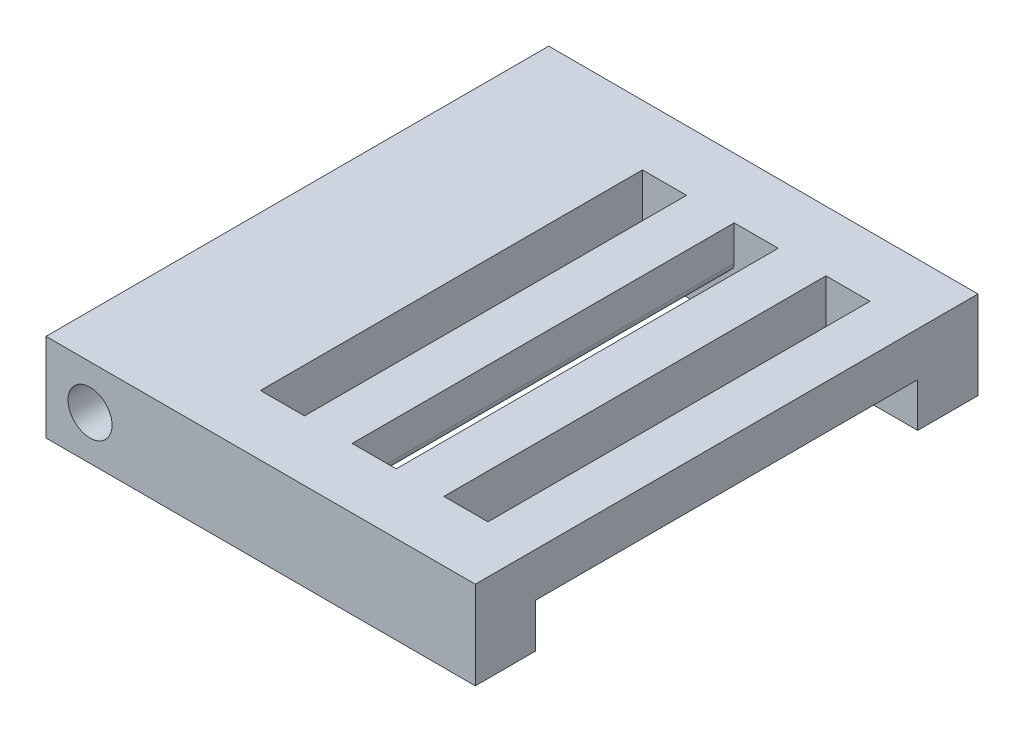
ISO-10303-21;
HEADER;
FILE_DESCRIPTION(('STEP AP214'),'2;1');
FILE_NAME('part.step','',(''),(''),'','','');
FILE_SCHEMA(('AUTOMOTIVE_DESIGN { 1 0 10303 214 1 1 1 1 }'));
ENDSEC;
DATA;
#1=APPLICATION_CONTEXT('core data for automotive mechanical design processes');
#2=APPLICATION_PROTOCOL_DEFINITION('international standard','automotive_design',2000,#1);
#3=PRODUCT_CONTEXT('',#1,'mechanical');
#4=PRODUCT('Part','Part','',(#3));
#5=PRODUCT_RELATED_PRODUCT_CATEGORY('part','',(#4));
#6=PRODUCT_DEFINITION_FORMATION('','',#4);
#7=PRODUCT_DEFINITION_CONTEXT('part definition',#1,'design');
#8=PRODUCT_DEFINITION('design','',#6,#7);
#9=PRODUCT_DEFINITION_SHAPE('','',#8);
#10=(LENGTH_UNIT() NAMED_UNIT(*) SI_UNIT(.MILLI.,.METRE.));
#11=(NAMED_UNIT(*) PLANE_ANGLE_UNIT() SI_UNIT($,.RADIAN.));
#12=(NAMED_UNIT(*) SI_UNIT($,.STERADIAN.) SOLID_ANGLE_UNIT());
#13=UNCERTAINTY_MEASURE_WITH_UNIT(LENGTH_MEASURE(1.E-05),#10,'distance_accuracy_value','');
#14=(GEOMETRIC_REPRESENTATION_CONTEXT(3) GLOBAL_UNCERTAINTY_ASSIGNED_CONTEXT((#13)) GLOBAL_UNIT_ASSIGNED_CONTEXT((#10,
#11,#12)) REPRESENTATION_CONTEXT('',''));
#15=CARTESIAN_POINT('',(0.,0.,0.));
#16=DIRECTION('',(0.,0.,1.));
#17=DIRECTION('',(1.,0.,0.));
#18=AXIS2_PLACEMENT_3D('',#15,#16,#17);
#19=CARTESIAN_POINT('',(0.,0.,0.));
#20=DIRECTION('',(0.,1.,0.));
#21=DIRECTION('',(0.,0.,1.));
#22=AXIS2_PLACEMENT_3D('',#19,#20,#21);
#23=PLANE('',#22);
#24=DIRECTION('',(0.,0.,-1.));
#25=VECTOR('',#24,1.);
#26=CARTESIAN_POINT('',(-33.75,0.,0.));
#27=LINE('',#26,#25);
#28=CARTESIAN_POINT('',(-33.75,0.,82.5));
#29=VERTEX_POINT('',#28);
#30=CARTESIAN_POINT('',(-33.75,0.,75.648107224862));
#31=VERTEX_POINT('',#30);
#32=EDGE_CURVE('E466',#29,#31,#27,.T.);
#33=ORIENTED_EDGE('',*,*,#32,.F.);
#34=DIRECTION('',(-1.,0.,0.));
#35=VECTOR('',#34,1.);
#36=CARTESIAN_POINT('',(0.,0.,82.5));
#37=LINE('',#36,#35);
#38=CARTESIAN_POINT('',(-82.5,0.,82.5));
#39=VERTEX_POINT('',#38);
#40=EDGE_CURVE('E344',#29,#39,#37,.T.);
#41=ORIENTED_EDGE('',*,*,#40,.T.);
#42=DIRECTION('',(0.,0.,1.));
#43=VECTOR('',#42,1.);
#44=CARTESIAN_POINT('',(-82.5,0.,0.));
#45=LINE('',#44,#43);
#46=CARTESIAN_POINT('',(-82.5,0.,25.4162676476213));
#47=VERTEX_POINT('',#46);
#48=EDGE_CURVE('E334',#47,#39,#45,.T.);
#49=ORIENTED_EDGE('',*,*,#48,.F.);
#50=DIRECTION('',(1.,0.,0.));
#51=VECTOR('',#50,1.);
#52=CARTESIAN_POINT('',(0.,0.,25.4162676476213));
#53=LINE('',#52,#51);
#54=CARTESIAN_POINT('',(-33.75,0.,25.4162676476213));
#55=VERTEX_POINT('',#54);
#56=EDGE_CURVE('E469',#47,#55,#53,.T.);
#57=ORIENTED_EDGE('',*,*,#56,.T.);
#58=DIRECTION('',(0.,0.,1.));
#59=VECTOR('',#58,1.);
#60=CARTESIAN_POINT('',(-33.75,0.,25.4162676476213));
#61=LINE('',#60,#59);
#62=CARTESIAN_POINT('',(-33.75,0.,32.2662676476213));
#63=VERTEX_POINT('',#62);
#64=EDGE_CURVE('E324',#55,#63,#61,.T.);
#65=ORIENTED_EDGE('',*,*,#64,.T.);
#66=DIRECTION('',(-1.,0.,0.));
#67=VECTOR('',#66,1.);
#68=CARTESIAN_POINT('',(-33.75,0.,32.2662676476213));
#69=LINE('',#68,#67);
#70=CARTESIAN_POINT('',(-65.,0.,32.2662676476213));
#71=VERTEX_POINT('',#70);
#72=EDGE_CURVE('E306',#63,#71,#69,.T.);
#73=ORIENTED_EDGE('',*,*,#72,.T.);
#74=DIRECTION('',(0.,0.,1.));
#75=VECTOR('',#74,1.);
#76=CARTESIAN_POINT('',(-65.,0.,0.));
#77=LINE('',#76,#75);
#78=CARTESIAN_POINT('',(-65.,0.,75.6481072248632));
#79=VERTEX_POINT('',#78);
#80=EDGE_CURVE('E320',#71,#79,#77,.T.);
#81=ORIENTED_EDGE('',*,*,#80,.T.);
#82=DIRECTION('',(1.,0.,0.));
#83=VECTOR('',#82,1.);
#84=CARTESIAN_POINT('',(-4.19931352051771E-13,0.,75.648107224862));
#85=LINE('',#84,#83);
#86=EDGE_CURVE('E331',#79,#31,#85,.T.);
#87=ORIENTED_EDGE('',*,*,#86,.T.);
#88=EDGE_LOOP('',(#33,#41,#49,#57,#65,#73,#81,#87));
#89=FACE_BOUND('',#88,.T.);
#90=ADVANCED_FACE('F167',(#89),#23,.F.);
#91=CARTESIAN_POINT('',(0.,10.,0.));
#92=DIRECTION('',(0.,1.,0.));
#93=DIRECTION('',(0.,0.,1.));
#94=AXIS2_PLACEMENT_3D('',#91,#92,#93);
#95=PLANE('',#94);
#96=DIRECTION('',(0.,0.,1.));
#97=VECTOR('',#96,1.);
#98=CARTESIAN_POINT('',(-54.5833333333333,10.,0.));
#99=LINE('',#98,#97);
#100=CARTESIAN_POINT('',(-54.5833333333333,10.,32.2662676476213));
#101=VERTEX_POINT('',#100);
#102=CARTESIAN_POINT('',(-54.5833333333333,10.,75.6481072248632));
#103=VERTEX_POINT('',#102);
#104=EDGE_CURVE('E437',#101,#103,#99,.T.);
#105=ORIENTED_EDGE('',*,*,#104,.F.);
#106=DIRECTION('',(-1.,0.,0.));
#107=VECTOR('',#106,1.);
#108=CARTESIAN_POINT('',(-33.75,10.,32.2662676476213));
#109=LINE('',#108,#107);
#110=CARTESIAN_POINT('',(-49.5833333333333,10.,32.2662676476213));
#111=VERTEX_POINT('',#110);
#112=EDGE_CURVE('E500',#111,#101,#109,.T.);
#113=ORIENTED_EDGE('',*,*,#112,.F.);
#114=DIRECTION('',(0.,0.,-1.));
#115=VECTOR('',#114,1.);
#116=CARTESIAN_POINT('',(-49.5833333333333,10.,0.));
#117=LINE('',#116,#115);
#118=CARTESIAN_POINT('',(-49.5833333333333,10.,75.6481072248632));
#119=VERTEX_POINT('',#118);
#120=EDGE_CURVE('E395',#119,#111,#117,.T.);
#121=ORIENTED_EDGE('',*,*,#120,.F.);
#122=DIRECTION('',(1.,0.,0.));
#123=VECTOR('',#122,1.);
#124=CARTESIAN_POINT('',(-4.19931352051779E-13,10.,75.6481072248635));
#125=LINE('',#124,#123);
#126=EDGE_CURVE('E435',#103,#119,#125,.T.);
#127=ORIENTED_EDGE('',*,*,#126,.F.);
#128=EDGE_LOOP('',(#105,#113,#121,#127));
#129=FACE_BOUND('',#128,.T.);
#130=DIRECTION('',(0.,0.,1.));
#131=VECTOR('',#130,1.);
#132=CARTESIAN_POINT('',(-44.1666666666666,10.,0.));
#133=LINE('',#132,#131);
#134=CARTESIAN_POINT('',(-44.1666666666666,10.,32.2662676476213));
#135=VERTEX_POINT('',#134);
#136=CARTESIAN_POINT('',(-44.1666666666666,10.,75.6481072248631));
#137=VERTEX_POINT('',#136);
#138=EDGE_CURVE('E443',#135,#137,#133,.T.);
#139=ORIENTED_EDGE('',*,*,#138,.F.);
#140=CARTESIAN_POINT('',(-39.1666666666666,10.,32.2662676476213));
#141=VERTEX_POINT('',#140);
#142=EDGE_CURVE('E314',#141,#135,#109,.T.);
#143=ORIENTED_EDGE('',*,*,#142,.F.);
#144=DIRECTION('',(0.,0.,-1.));
#145=VECTOR('',#144,1.);
#146=CARTESIAN_POINT('',(-39.1666666666666,10.,0.));
#147=LINE('',#146,#145);
#148=CARTESIAN_POINT('',(-39.1666666666666,10.,75.6481072248631));
#149=VERTEX_POINT('',#148);
#150=EDGE_CURVE('E445',#149,#141,#147,.T.);
#151=ORIENTED_EDGE('',*,*,#150,.F.);
#152=DIRECTION('',(1.,0.,0.));
#153=VECTOR('',#152,1.);
#154=CARTESIAN_POINT('',(-4.19931352051778E-13,10.,75.6481072248633));
#155=LINE('',#154,#153);
#156=EDGE_CURVE('E440',#137,#149,#155,.T.);
#157=ORIENTED_EDGE('',*,*,#156,.F.);
#158=EDGE_LOOP('',(#139,#143,#151,#157));
#159=FACE_BOUND('',#158,.T.);
#160=DIRECTION('',(-1.,0.,0.));
#161=VECTOR('',#160,1.);
#162=CARTESIAN_POINT('',(0.,10.,82.5));
#163=LINE('',#162,#161);
#164=CARTESIAN_POINT('',(-33.75,10.,82.5));
#165=VERTEX_POINT('',#164);
#166=CARTESIAN_POINT('',(-82.5,10.,82.5));
#167=VERTEX_POINT('',#166);
#168=EDGE_CURVE('E340',#165,#167,#163,.T.);
#169=ORIENTED_EDGE('',*,*,#168,.F.);
#170=DIRECTION('',(0.,0.,1.));
#171=VECTOR('',#170,1.);
#172=CARTESIAN_POINT('',(-33.75,10.,0.));
#173=LINE('',#172,#171);
#174=CARTESIAN_POINT('',(-33.75,10.,25.4162676476213));
#175=VERTEX_POINT('',#174);
#176=EDGE_CURVE('E447',#175,#165,#173,.T.);
#177=ORIENTED_EDGE('',*,*,#176,.F.);
#178=DIRECTION('',(1.,0.,0.));
#179=VECTOR('',#178,1.);
#180=CARTESIAN_POINT('',(0.,10.,25.4162676476213));
#181=LINE('',#180,#179);
#182=CARTESIAN_POINT('',(-82.5,10.,25.4162676476213));
#183=VERTEX_POINT('',#182);
#184=EDGE_CURVE('E473',#183,#175,#181,.T.);
#185=ORIENTED_EDGE('',*,*,#184,.F.);
#186=DIRECTION('',(0.,0.,1.));
#187=VECTOR('',#186,1.);
#188=CARTESIAN_POINT('',(-82.5,10.,0.));
#189=LINE('',#188,#187);
#190=EDGE_CURVE('E448',#183,#167,#189,.T.);
#191=ORIENTED_EDGE('',*,*,#190,.T.);
#192=EDGE_LOOP('',(#169,#177,#185,#191));
#193=FACE_BOUND('',#192,.T.);
#194=CARTESIAN_POINT('',(-60.,10.,32.2662676476213));
#195=VERTEX_POINT('',#194);
#196=CARTESIAN_POINT('',(-65.,10.,32.2662676476213));
#197=VERTEX_POINT('',#196);
#198=EDGE_CURVE('E309',#195,#197,#109,.T.);
#199=ORIENTED_EDGE('',*,*,#198,.F.);
#200=DIRECTION('',(0.,0.,-1.));
#201=VECTOR('',#200,1.);
#202=CARTESIAN_POINT('',(-60.,10.,0.));
#203=LINE('',#202,#201);
#204=CARTESIAN_POINT('',(-60.,10.,75.6481072248632));
#205=VERTEX_POINT('',#204);
#206=EDGE_CURVE('E433',#205,#195,#203,.T.);
#207=ORIENTED_EDGE('',*,*,#206,.F.);
#208=DIRECTION('',(1.,0.,0.));
#209=VECTOR('',#208,1.);
#210=CARTESIAN_POINT('',(0.,10.,75.6481072248632));
#211=LINE('',#210,#209);
#212=CARTESIAN_POINT('',(-65.,10.,75.6481072248632));
#213=VERTEX_POINT('',#212);
#214=EDGE_CURVE('E347',#213,#205,#211,.T.);
#215=ORIENTED_EDGE('',*,*,#214,.F.);
#216=DIRECTION('',(0.,0.,1.));
#217=VECTOR('',#216,1.);
#218=CARTESIAN_POINT('',(-65.,10.,0.));
#219=LINE('',#218,#217);
#220=EDGE_CURVE('E431',#197,#213,#219,.T.);
#221=ORIENTED_EDGE('',*,*,#220,.F.);
#222=EDGE_LOOP('',(#199,#207,#215,#221));
#223=FACE_BOUND('',#222,.T.);
#224=ADVANCED_FACE('F506',(#129,#159,#193,#223),#95,.T.);
#225=CARTESIAN_POINT('',(-4.19931352051771E-13,10.,75.648107224862));
#226=DIRECTION('',(0.,0.,-1.));
#227=DIRECTION('',(-1.,0.,0.));
#228=AXIS2_PLACEMENT_3D('',#225,#226,#227);
#229=PLANE('',#228);
#230=DIRECTION('',(-1.,0.,0.));
#231=VECTOR('',#230,1.);
#232=CARTESIAN_POINT('',(65.,5.,75.6481072248632));
#233=LINE('',#232,#231);
#234=CARTESIAN_POINT('',(-33.75,5.,75.6481072248632));
#235=VERTEX_POINT('',#234);
#236=CARTESIAN_POINT('',(-39.1666666666666,5.,75.6481072248632));
#237=VERTEX_POINT('',#236);
#238=EDGE_CURVE('E413',#235,#237,#233,.T.);
#239=ORIENTED_EDGE('',*,*,#238,.F.);
#240=DIRECTION('',(0.,-1.,0.));
#241=VECTOR('',#240,1.);
#242=CARTESIAN_POINT('',(-33.75,10.,75.6481072248618));
#243=LINE('',#242,#241);
#244=EDGE_CURVE('E418',#235,#31,#243,.T.);
#245=ORIENTED_EDGE('',*,*,#244,.T.);
#246=ORIENTED_EDGE('',*,*,#86,.F.);
#247=DIRECTION('',(0.,-1.,0.));
#248=VECTOR('',#247,1.);
#249=CARTESIAN_POINT('',(-65.,10.,75.6481072248632));
#250=LINE('',#249,#248);
#251=EDGE_CURVE('E330',#213,#79,#250,.T.);
#252=ORIENTED_EDGE('',*,*,#251,.F.);
#253=ORIENTED_EDGE('',*,*,#214,.T.);
#254=DIRECTION('',(0.,-1.,0.));
#255=VECTOR('',#254,1.);
#256=CARTESIAN_POINT('',(-60.,10.,75.6481072248632));
#257=LINE('',#256,#255);
#258=CARTESIAN_POINT('',(-60.,5.,75.6481072248632));
#259=VERTEX_POINT('',#258);
#260=EDGE_CURVE('E364',#205,#259,#257,.T.);
#261=ORIENTED_EDGE('',*,*,#260,.T.);
#262=CARTESIAN_POINT('',(-55.5833333333333,5.,75.6481072248632));
#263=VERTEX_POINT('',#262);
#264=EDGE_CURVE('E414',#263,#259,#233,.T.);
#265=ORIENTED_EDGE('',*,*,#264,.F.);
#266=CARTESIAN_POINT('',(-55.5833333333333,6.,75.6481072248617));
#267=DIRECTION('',(0.,0.,-1.));
#268=DIRECTION('',(-1.,0.,0.));
#269=AXIS2_PLACEMENT_3D('',#266,#267,#268);
#270=CIRCLE('',#269,1.);
#271=CARTESIAN_POINT('',(-54.5833333333333,6.,75.6481072248632));
#272=VERTEX_POINT('',#271);
#273=EDGE_CURVE('E12',#263,#272,#270,.F.);
#274=ORIENTED_EDGE('',*,*,#273,.T.);
#275=DIRECTION('',(0.,-1.,0.));
#276=VECTOR('',#275,1.);
#277=CARTESIAN_POINT('',(-54.5833333333333,10.,75.6481072248632));
#278=LINE('',#277,#276);
#279=EDGE_CURVE('E356',#103,#272,#278,.T.);
#280=ORIENTED_EDGE('',*,*,#279,.F.);
#281=ORIENTED_EDGE('',*,*,#126,.T.);
#282=DIRECTION('',(0.,-1.,0.));
#283=VECTOR('',#282,1.);
#284=CARTESIAN_POINT('',(-49.5833333333333,10.,75.6481072248632));
#285=LINE('',#284,#283);
#286=CARTESIAN_POINT('',(-49.5833333333333,6.,75.6481072248632));
#287=VERTEX_POINT('',#286);
#288=EDGE_CURVE('E359',#119,#287,#285,.T.);
#289=ORIENTED_EDGE('',*,*,#288,.T.);
#290=CARTESIAN_POINT('',(-48.5833333333333,6.,75.6481072248617));
#291=DIRECTION('',(0.,0.,-1.));
#292=DIRECTION('',(-1.,0.,0.));
#293=AXIS2_PLACEMENT_3D('',#290,#291,#292);
#294=CIRCLE('',#293,1.);
#295=CARTESIAN_POINT('',(-48.5833333333333,5.,75.6481072248632));
#296=VERTEX_POINT('',#295);
#297=EDGE_CURVE('E378',#287,#296,#294,.F.);
#298=ORIENTED_EDGE('',*,*,#297,.T.);
#299=CARTESIAN_POINT('',(-44.1666666666666,5.,75.6481072248632));
#300=VERTEX_POINT('',#299);
#301=EDGE_CURVE('E407',#300,#296,#233,.T.);
#302=ORIENTED_EDGE('',*,*,#301,.F.);
#303=DIRECTION('',(0.,-1.,0.));
#304=VECTOR('',#303,1.);
#305=CARTESIAN_POINT('',(-44.1666666666666,10.,75.6481072248631));
#306=LINE('',#305,#304);
#307=EDGE_CURVE('E352',#137,#300,#306,.T.);
#308=ORIENTED_EDGE('',*,*,#307,.F.);
#309=ORIENTED_EDGE('',*,*,#156,.T.);
#310=DIRECTION('',(0.,-1.,0.));
#311=VECTOR('',#310,1.);
#312=CARTESIAN_POINT('',(-39.1666666666666,10.,75.6481072248631));
#313=LINE('',#312,#311);
#314=EDGE_CURVE('E353',#149,#237,#313,.T.);
#315=ORIENTED_EDGE('',*,*,#314,.T.);
#316=EDGE_LOOP('',(#239,#245,#246,#252,#253,#261,#265,#274,#280,#281,#289,#298,#302,#308,#309,#315));
#317=FACE_BOUND('',#316,.T.);
#318=ADVANCED_FACE('F405',(#317),#229,.T.);
#319=CARTESIAN_POINT('',(0.,10.,82.5));
#320=DIRECTION('',(0.,0.,1.));
#321=DIRECTION('',(1.,0.,0.));
#322=AXIS2_PLACEMENT_3D('',#319,#320,#321);
#323=PLANE('',#322);
#324=CARTESIAN_POINT('',(-77.4999999999999,5.,82.5));
#325=DIRECTION('',(0.,0.,-1.));
#326=DIRECTION('',(1.,0.,0.));
#327=AXIS2_PLACEMENT_3D('',#324,#325,#326);
#328=CIRCLE('',#327,2.50000000000001);
#329=CARTESIAN_POINT('',(-74.9999999999999,5.,82.5));
#330=VERTEX_POINT('',#329);
#331=EDGE_CURVE('E332',#330,#330,#328,.T.);
#332=ORIENTED_EDGE('',*,*,#331,.T.);
#333=EDGE_LOOP('',(#332));
#334=FACE_BOUND('',#333,.T.);
#335=ORIENTED_EDGE('',*,*,#40,.F.);
#336=DIRECTION('',(0.,1.,0.));
#337=VECTOR('',#336,1.);
#338=CARTESIAN_POINT('',(-33.75,0.,82.5));
#339=LINE('',#338,#337);
#340=EDGE_CURVE('E459',#29,#165,#339,.T.);
#341=ORIENTED_EDGE('',*,*,#340,.T.);
#342=ORIENTED_EDGE('',*,*,#168,.T.);
#343=DIRECTION('',(0.,-1.,0.));
#344=VECTOR('',#343,1.);
#345=CARTESIAN_POINT('',(-82.5,10.,82.5));
#346=LINE('',#345,#344);
#347=EDGE_CURVE('E348',#167,#39,#346,.T.);
#348=ORIENTED_EDGE('',*,*,#347,.T.);
#349=EDGE_LOOP('',(#335,#341,#342,#348));
#350=FACE_BOUND('',#349,.T.);
#351=ADVANCED_FACE('F458',(#334,#350),#323,.T.);
#352=CARTESIAN_POINT('',(-60.,10.,0.));
#353=DIRECTION('',(-1.,0.,0.));
#354=DIRECTION('',(0.,0.,1.));
#355=AXIS2_PLACEMENT_3D('',#352,#353,#354);
#356=PLANE('',#355);
#357=DIRECTION('',(0.,1.,0.));
#358=VECTOR('',#357,1.);
#359=CARTESIAN_POINT('',(-60.,10.,32.2662676476213));
#360=LINE('',#359,#358);
#361=CARTESIAN_POINT('',(-60.,5.,32.2662676476213));
#362=VERTEX_POINT('',#361);
#363=EDGE_CURVE('E495',#362,#195,#360,.T.);
#364=ORIENTED_EDGE('',*,*,#363,.F.);
#365=DIRECTION('',(0.,0.,1.));
#366=VECTOR('',#365,1.);
#367=CARTESIAN_POINT('',(-60.,5.,0.));
#368=LINE('',#367,#366);
#369=EDGE_CURVE('E337',#362,#259,#368,.T.);
#370=ORIENTED_EDGE('',*,*,#369,.T.);
#371=ORIENTED_EDGE('',*,*,#260,.F.);
#372=ORIENTED_EDGE('',*,*,#206,.T.);
#373=EDGE_LOOP('',(#364,#370,#371,#372));
#374=FACE_BOUND('',#373,.T.);
#375=ADVANCED_FACE('F533',(#374),#356,.T.);
#376=CARTESIAN_POINT('',(-54.5833333333333,10.,0.));
#377=DIRECTION('',(1.,0.,0.));
#378=DIRECTION('',(0.,0.,-1.));
#379=AXIS2_PLACEMENT_3D('',#376,#377,#378);
#380=PLANE('',#379);
#381=ORIENTED_EDGE('',*,*,#279,.T.);
#382=DIRECTION('',(0.,0.,-1.));
#383=VECTOR('',#382,1.);
#384=CARTESIAN_POINT('',(-54.5833333333333,6.,0.));
#385=LINE('',#384,#383);
#386=CARTESIAN_POINT('',(-54.5833333333333,6.,32.2662676476213));
#387=VERTEX_POINT('',#386);
#388=EDGE_CURVE('E374',#272,#387,#385,.T.);
#389=ORIENTED_EDGE('',*,*,#388,.T.);
#390=DIRECTION('',(0.,-1.,0.));
#391=VECTOR('',#390,1.);
#392=CARTESIAN_POINT('',(-54.5833333333333,10.,32.2662676476213));
#393=LINE('',#392,#391);
#394=EDGE_CURVE('E313',#101,#387,#393,.T.);
#395=ORIENTED_EDGE('',*,*,#394,.F.);
#396=ORIENTED_EDGE('',*,*,#104,.T.);
#397=EDGE_LOOP('',(#381,#389,#395,#396));
#398=FACE_BOUND('',#397,.T.);
#399=ADVANCED_FACE('F638',(#398),#380,.T.);
#400=CARTESIAN_POINT('',(-49.5833333333333,10.,0.));
#401=DIRECTION('',(-1.,0.,0.));
#402=DIRECTION('',(0.,0.,1.));
#403=AXIS2_PLACEMENT_3D('',#400,#401,#402);
#404=PLANE('',#403);
#405=DIRECTION('',(0.,1.,0.));
#406=VECTOR('',#405,1.);
#407=CARTESIAN_POINT('',(-49.5833333333333,10.,32.2662676476213));
#408=LINE('',#407,#406);
#409=CARTESIAN_POINT('',(-49.5833333333333,6.,32.2662676476213));
#410=VERTEX_POINT('',#409);
#411=EDGE_CURVE('E385',#410,#111,#408,.T.);
#412=ORIENTED_EDGE('',*,*,#411,.F.);
#413=DIRECTION('',(0.,0.,1.));
#414=VECTOR('',#413,1.);
#415=CARTESIAN_POINT('',(-49.5833333333333,6.,0.));
#416=LINE('',#415,#414);
#417=EDGE_CURVE('E369',#410,#287,#416,.T.);
#418=ORIENTED_EDGE('',*,*,#417,.T.);
#419=ORIENTED_EDGE('',*,*,#288,.F.);
#420=ORIENTED_EDGE('',*,*,#120,.T.);
#421=EDGE_LOOP('',(#412,#418,#419,#420));
#422=FACE_BOUND('',#421,.T.);
#423=ADVANCED_FACE('F393',(#422),#404,.T.);
#424=CARTESIAN_POINT('',(-44.1666666666666,10.,0.));
#425=DIRECTION('',(1.,0.,0.));
#426=DIRECTION('',(0.,0.,-1.));
#427=AXIS2_PLACEMENT_3D('',#424,#425,#426);
#428=PLANE('',#427);
#429=DIRECTION('',(0.,-1.,0.));
#430=VECTOR('',#429,1.);
#431=CARTESIAN_POINT('',(-44.1666666666666,10.,32.2662676476213));
#432=LINE('',#431,#430);
#433=CARTESIAN_POINT('',(-44.1666666666666,5.,32.2662676476213));
#434=VERTEX_POINT('',#433);
#435=EDGE_CURVE('E398',#135,#434,#432,.T.);
#436=ORIENTED_EDGE('',*,*,#435,.F.);
#437=ORIENTED_EDGE('',*,*,#138,.T.);
#438=ORIENTED_EDGE('',*,*,#307,.T.);
#439=DIRECTION('',(0.,0.,-1.));
#440=VECTOR('',#439,1.);
#441=CARTESIAN_POINT('',(-44.1666666666666,5.,0.));
#442=LINE('',#441,#440);
#443=EDGE_CURVE('E412',#300,#434,#442,.T.);
#444=ORIENTED_EDGE('',*,*,#443,.T.);
#445=EDGE_LOOP('',(#436,#437,#438,#444));
#446=FACE_BOUND('',#445,.T.);
#447=ADVANCED_FACE('F509',(#446),#428,.T.);
#448=CARTESIAN_POINT('',(-39.1666666666666,10.,0.));
#449=DIRECTION('',(-1.,0.,0.));
#450=DIRECTION('',(0.,0.,1.));
#451=AXIS2_PLACEMENT_3D('',#448,#449,#450);
#452=PLANE('',#451);
#453=DIRECTION('',(0.,1.,0.));
#454=VECTOR('',#453,1.);
#455=CARTESIAN_POINT('',(-39.1666666666666,10.,32.2662676476213));
#456=LINE('',#455,#454);
#457=CARTESIAN_POINT('',(-39.1666666666666,5.,32.2662676476213));
#458=VERTEX_POINT('',#457);
#459=EDGE_CURVE('E478',#458,#141,#456,.T.);
#460=ORIENTED_EDGE('',*,*,#459,.F.);
#461=DIRECTION('',(0.,0.,1.));
#462=VECTOR('',#461,1.);
#463=CARTESIAN_POINT('',(-39.1666666666666,5.,0.));
#464=LINE('',#463,#462);
#465=EDGE_CURVE('E424',#458,#237,#464,.T.);
#466=ORIENTED_EDGE('',*,*,#465,.T.);
#467=ORIENTED_EDGE('',*,*,#314,.F.);
#468=ORIENTED_EDGE('',*,*,#150,.T.);
#469=EDGE_LOOP('',(#460,#466,#467,#468));
#470=FACE_BOUND('',#469,.T.);
#471=ADVANCED_FACE('F511',(#470),#452,.T.);
#472=CARTESIAN_POINT('',(-33.75,10.,0.));
#473=DIRECTION('',(1.,0.,0.));
#474=DIRECTION('',(0.,0.,-1.));
#475=AXIS2_PLACEMENT_3D('',#472,#473,#474);
#476=PLANE('',#475);
#477=DIRECTION('',(0.,0.,-1.));
#478=VECTOR('',#477,1.);
#479=CARTESIAN_POINT('',(-33.75,5.,0.));
#480=LINE('',#479,#478);
#481=CARTESIAN_POINT('',(-33.75,5.,32.2662676476213));
#482=VERTEX_POINT('',#481);
#483=EDGE_CURVE('E417',#235,#482,#480,.T.);
#484=ORIENTED_EDGE('',*,*,#483,.T.);
#485=DIRECTION('',(0.,-1.,0.));
#486=VECTOR('',#485,1.);
#487=CARTESIAN_POINT('',(-33.75,41.9919521129924,32.2662676476213));
#488=LINE('',#487,#486);
#489=EDGE_CURVE('E325',#482,#63,#488,.T.);
#490=ORIENTED_EDGE('',*,*,#489,.T.);
#491=ORIENTED_EDGE('',*,*,#64,.F.);
#492=DIRECTION('',(0.,1.,0.));
#493=VECTOR('',#492,1.);
#494=CARTESIAN_POINT('',(-33.75,0.,25.4162676476213));
#495=LINE('',#494,#493);
#496=EDGE_CURVE('E471',#55,#175,#495,.T.);
#497=ORIENTED_EDGE('',*,*,#496,.T.);
#498=ORIENTED_EDGE('',*,*,#176,.T.);
#499=ORIENTED_EDGE('',*,*,#340,.F.);
#500=ORIENTED_EDGE('',*,*,#32,.T.);
#501=ORIENTED_EDGE('',*,*,#244,.F.);
#502=EDGE_LOOP('',(#484,#490,#491,#497,#498,#499,#500,#501));
#503=FACE_BOUND('',#502,.T.);
#504=ADVANCED_FACE('F486',(#503),#476,.T.);
#505=CARTESIAN_POINT('',(-65.,10.,0.));
#506=DIRECTION('',(1.,0.,0.));
#507=DIRECTION('',(0.,0.,-1.));
#508=AXIS2_PLACEMENT_3D('',#505,#506,#507);
#509=PLANE('',#508);
#510=DIRECTION('',(0.,-1.,0.));
#511=VECTOR('',#510,1.);
#512=CARTESIAN_POINT('',(-65.,41.9919521129924,32.2662676476213));
#513=LINE('',#512,#511);
#514=EDGE_CURVE('E301',#197,#71,#513,.T.);
#515=ORIENTED_EDGE('',*,*,#514,.F.);
#516=ORIENTED_EDGE('',*,*,#220,.T.);
#517=ORIENTED_EDGE('',*,*,#251,.T.);
#518=ORIENTED_EDGE('',*,*,#80,.F.);
#519=EDGE_LOOP('',(#515,#516,#517,#518));
#520=FACE_BOUND('',#519,.T.);
#521=ADVANCED_FACE('F328',(#520),#509,.T.);
#522=CARTESIAN_POINT('',(-82.5,10.,0.));
#523=DIRECTION('',(1.,0.,0.));
#524=DIRECTION('',(0.,0.,-1.));
#525=AXIS2_PLACEMENT_3D('',#522,#523,#524);
#526=PLANE('',#525);
#527=ORIENTED_EDGE('',*,*,#190,.F.);
#528=DIRECTION('',(0.,1.,0.));
#529=VECTOR('',#528,1.);
#530=CARTESIAN_POINT('',(-82.5,0.,25.4162676476213));
#531=LINE('',#530,#529);
#532=EDGE_CURVE('E465',#47,#183,#531,.T.);
#533=ORIENTED_EDGE('',*,*,#532,.F.);
#534=ORIENTED_EDGE('',*,*,#48,.T.);
#535=ORIENTED_EDGE('',*,*,#347,.F.);
#536=EDGE_LOOP('',(#527,#533,#534,#535));
#537=FACE_BOUND('',#536,.T.);
#538=ADVANCED_FACE('F462',(#537),#526,.F.);
#539=CARTESIAN_POINT('',(-77.4999999999999,5.,82.5));
#540=DIRECTION('',(0.,0.,-1.));
#541=DIRECTION('',(-1.,0.,0.));
#542=AXIS2_PLACEMENT_3D('',#539,#540,#541);
#543=CYLINDRICAL_SURFACE('',#542,2.50000000000001);
#544=CARTESIAN_POINT('',(-77.4999999999999,5.,25.4162676476213));
#545=DIRECTION('',(0.,0.,1.));
#546=DIRECTION('',(1.,0.,0.));
#547=AXIS2_PLACEMENT_3D('',#544,#545,#546);
#548=CIRCLE('',#547,2.50000000000001);
#549=CARTESIAN_POINT('',(-74.9999999999999,5.,25.4162676476213));
#550=VERTEX_POINT('',#549);
#551=EDGE_CURVE('E480',#550,#550,#548,.F.);
#552=ORIENTED_EDGE('',*,*,#551,.T.);
#553=EDGE_LOOP('',(#552));
#554=FACE_BOUND('',#553,.T.);
#555=ORIENTED_EDGE('',*,*,#331,.F.);
#556=EDGE_LOOP('',(#555));
#557=FACE_BOUND('',#556,.T.);
#558=ADVANCED_FACE('F537',(#554,#557),#543,.F.);
#559=CARTESIAN_POINT('',(0.,5.,0.));
#560=DIRECTION('',(0.,-1.,0.));
#561=DIRECTION('',(0.,0.,-1.));
#562=AXIS2_PLACEMENT_3D('',#559,#560,#561);
#563=PLANE('',#562);
#564=DIRECTION('',(-1.,0.,0.));
#565=VECTOR('',#564,1.);
#566=CARTESIAN_POINT('',(0.,5.,32.2662676476213));
#567=LINE('',#566,#565);
#568=EDGE_CURVE('E397',#482,#458,#567,.T.);
#569=ORIENTED_EDGE('',*,*,#568,.F.);
#570=ORIENTED_EDGE('',*,*,#483,.F.);
#571=ORIENTED_EDGE('',*,*,#238,.T.);
#572=ORIENTED_EDGE('',*,*,#465,.F.);
#573=EDGE_LOOP('',(#569,#570,#571,#572));
#574=FACE_BOUND('',#573,.T.);
#575=ADVANCED_FACE('F488',(#574),#563,.T.);
#576=ORIENTED_EDGE('',*,*,#301,.T.);
#577=DIRECTION('',(0.,0.,1.));
#578=VECTOR('',#577,1.);
#579=CARTESIAN_POINT('',(-48.5833333333333,5.,0.));
#580=LINE('',#579,#578);
#581=CARTESIAN_POINT('',(-48.5833333333333,5.,32.2662676476213));
#582=VERTEX_POINT('',#581);
#583=EDGE_CURVE('E372',#296,#582,#580,.F.);
#584=ORIENTED_EDGE('',*,*,#583,.T.);
#585=DIRECTION('',(-1.,0.,0.));
#586=VECTOR('',#585,1.);
#587=CARTESIAN_POINT('',(0.,5.,32.2662676476213));
#588=LINE('',#587,#586);
#589=EDGE_CURVE('E388',#434,#582,#588,.T.);
#590=ORIENTED_EDGE('',*,*,#589,.F.);
#591=ORIENTED_EDGE('',*,*,#443,.F.);
#592=EDGE_LOOP('',(#576,#584,#590,#591));
#593=FACE_BOUND('',#592,.T.);
#594=ADVANCED_FACE('F410',(#593),#563,.T.);
#595=DIRECTION('',(-1.,0.,0.));
#596=VECTOR('',#595,1.);
#597=CARTESIAN_POINT('',(0.,5.,32.2662676476213));
#598=LINE('',#597,#596);
#599=CARTESIAN_POINT('',(-55.5833333333333,5.,32.2662676476213));
#600=VERTEX_POINT('',#599);
#601=EDGE_CURVE('E351',#600,#362,#598,.T.);
#602=ORIENTED_EDGE('',*,*,#601,.F.);
#603=DIRECTION('',(0.,0.,-1.));
#604=VECTOR('',#603,1.);
#605=CARTESIAN_POINT('',(-55.5833333333333,5.,0.));
#606=LINE('',#605,#604);
#607=EDGE_CURVE('E182',#600,#263,#606,.F.);
#608=ORIENTED_EDGE('',*,*,#607,.T.);
#609=ORIENTED_EDGE('',*,*,#264,.T.);
#610=ORIENTED_EDGE('',*,*,#369,.F.);
#611=EDGE_LOOP('',(#602,#608,#609,#610));
#612=FACE_BOUND('',#611,.T.);
#613=ADVANCED_FACE('F561',(#612),#563,.T.);
#614=CARTESIAN_POINT('',(0.,0.,25.4162676476213));
#615=DIRECTION('',(0.,0.,1.));
#616=DIRECTION('',(1.,0.,0.));
#617=AXIS2_PLACEMENT_3D('',#614,#615,#616);
#618=PLANE('',#617);
#619=ORIENTED_EDGE('',*,*,#184,.T.);
#620=ORIENTED_EDGE('',*,*,#496,.F.);
#621=ORIENTED_EDGE('',*,*,#56,.F.);
#622=ORIENTED_EDGE('',*,*,#532,.T.);
#623=EDGE_LOOP('',(#619,#620,#621,#622));
#624=FACE_BOUND('',#623,.T.);
#625=ORIENTED_EDGE('',*,*,#551,.F.);
#626=EDGE_LOOP('',(#625));
#627=FACE_BOUND('',#626,.T.);
#628=ADVANCED_FACE('F573',(#624,#627),#618,.F.);
#629=CARTESIAN_POINT('',(-33.75,41.9919521129924,32.2662676476213));
#630=DIRECTION('',(0.,0.,1.));
#631=DIRECTION('',(1.,0.,0.));
#632=AXIS2_PLACEMENT_3D('',#629,#630,#631);
#633=PLANE('',#632);
#634=ORIENTED_EDGE('',*,*,#568,.T.);
#635=ORIENTED_EDGE('',*,*,#459,.T.);
#636=ORIENTED_EDGE('',*,*,#142,.T.);
#637=ORIENTED_EDGE('',*,*,#435,.T.);
#638=ORIENTED_EDGE('',*,*,#589,.T.);
#639=CARTESIAN_POINT('',(-48.5833333333333,6.,32.2662676476213));
#640=DIRECTION('',(0.,0.,1.));
#641=DIRECTION('',(1.,0.,0.));
#642=AXIS2_PLACEMENT_3D('',#639,#640,#641);
#643=CIRCLE('',#642,1.);
#644=EDGE_CURVE('E380',#582,#410,#643,.F.);
#645=ORIENTED_EDGE('',*,*,#644,.T.);
#646=ORIENTED_EDGE('',*,*,#411,.T.);
#647=ORIENTED_EDGE('',*,*,#112,.T.);
#648=ORIENTED_EDGE('',*,*,#394,.T.);
#649=CARTESIAN_POINT('',(-55.5833333333333,6.,32.2662676476213));
#650=DIRECTION('',(0.,0.,1.));
#651=DIRECTION('',(1.,0.,0.));
#652=AXIS2_PLACEMENT_3D('',#649,#650,#651);
#653=CIRCLE('',#652,1.);
#654=EDGE_CURVE('E175',#387,#600,#653,.F.);
#655=ORIENTED_EDGE('',*,*,#654,.T.);
#656=ORIENTED_EDGE('',*,*,#601,.T.);
#657=ORIENTED_EDGE('',*,*,#363,.T.);
#658=ORIENTED_EDGE('',*,*,#198,.T.);
#659=ORIENTED_EDGE('',*,*,#514,.T.);
#660=ORIENTED_EDGE('',*,*,#72,.F.);
#661=ORIENTED_EDGE('',*,*,#489,.F.);
#662=EDGE_LOOP('',(#634,#635,#636,#637,#638,#645,#646,#647,#648,#655,#656,#657,#658,#659,#660,#661));
#663=FACE_BOUND('',#662,.T.);
#664=ADVANCED_FACE('F304',(#663),#633,.T.);
#665=CARTESIAN_POINT('',(-48.5833333333333,6.,0.));
#666=DIRECTION('',(0.,0.,1.));
#667=DIRECTION('',(1.,0.,0.));
#668=AXIS2_PLACEMENT_3D('',#665,#666,#667);
#669=CYLINDRICAL_SURFACE('',#668,1.);
#670=ORIENTED_EDGE('',*,*,#644,.F.);
#671=ORIENTED_EDGE('',*,*,#583,.F.);
#672=ORIENTED_EDGE('',*,*,#297,.F.);
#673=ORIENTED_EDGE('',*,*,#417,.F.);
#674=EDGE_LOOP('',(#670,#671,#672,#673));
#675=FACE_BOUND('',#674,.T.);
#676=ADVANCED_FACE('F400',(#675),#669,.T.);
#677=CARTESIAN_POINT('',(-55.5833333333333,6.,0.));
#678=DIRECTION('',(0.,0.,-1.));
#679=DIRECTION('',(-1.,0.,0.));
#680=AXIS2_PLACEMENT_3D('',#677,#678,#679);
#681=CYLINDRICAL_SURFACE('',#680,1.);
#682=ORIENTED_EDGE('',*,*,#273,.F.);
#683=ORIENTED_EDGE('',*,*,#607,.F.);
#684=ORIENTED_EDGE('',*,*,#654,.F.);
#685=ORIENTED_EDGE('',*,*,#388,.F.);
#686=EDGE_LOOP('',(#682,#683,#684,#685));
#687=FACE_BOUND('',#686,.T.);
#688=ADVANCED_FACE('F169',(#687),#681,.T.);
#689=CLOSED_SHELL('',(#90,#224,#318,#351,#375,#399,#423,#447,#471,#504,#521,#538,#558,#575,#594,
#613,#628,#664,#676,#688));
#690=MANIFOLD_SOLID_BREP('B2',#689);
#691=ADVANCED_BREP_SHAPE_REPRESENTATION('',(#18,#690),#14);
#692=SHAPE_DEFINITION_REPRESENTATION(#9,#691);
ENDSEC;
END-ISO-10303-21;
